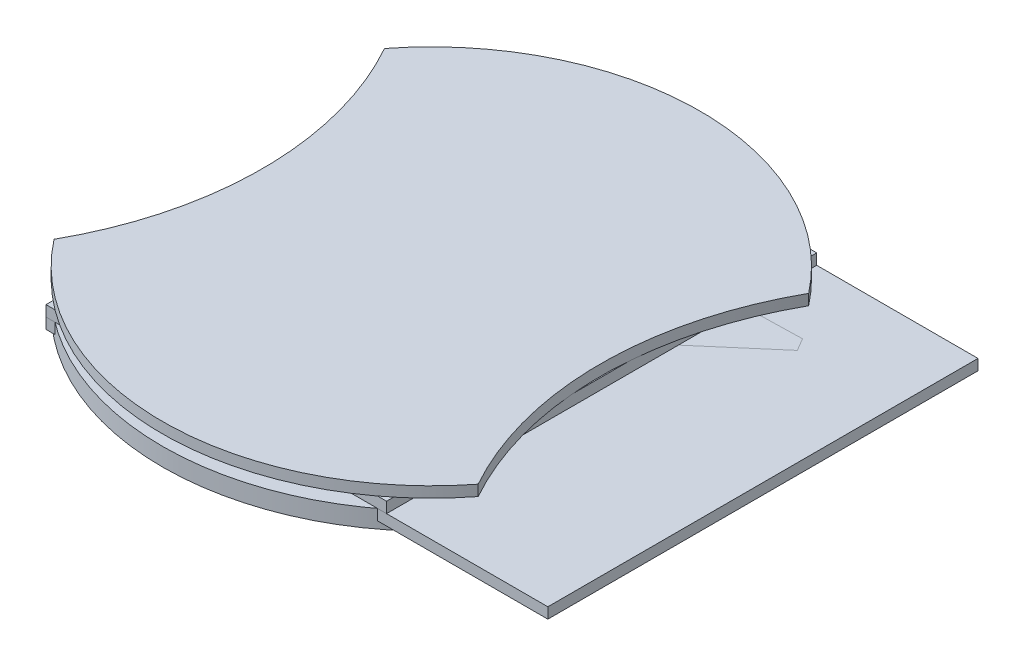
ISO-10303-21;
HEADER;
FILE_DESCRIPTION(('STEP AP214'),'2;1');
FILE_NAME('part.step','',(''),(''),'','','');
FILE_SCHEMA(('AUTOMOTIVE_DESIGN { 1 0 10303 214 1 1 1 1 }'));
ENDSEC;
DATA;
#1=APPLICATION_CONTEXT('core data for automotive mechanical design processes');
#2=APPLICATION_PROTOCOL_DEFINITION('international standard','automotive_design',2000,#1);
#3=PRODUCT_CONTEXT('',#1,'mechanical');
#4=PRODUCT('Part','Part','',(#3));
#5=PRODUCT_RELATED_PRODUCT_CATEGORY('part','',(#4));
#6=PRODUCT_DEFINITION_FORMATION('','',#4);
#7=PRODUCT_DEFINITION_CONTEXT('part definition',#1,'design');
#8=PRODUCT_DEFINITION('design','',#6,#7);
#9=PRODUCT_DEFINITION_SHAPE('','',#8);
#10=(LENGTH_UNIT() NAMED_UNIT(*) SI_UNIT(.MILLI.,.METRE.));
#11=(NAMED_UNIT(*) PLANE_ANGLE_UNIT() SI_UNIT($,.RADIAN.));
#12=(NAMED_UNIT(*) SI_UNIT($,.STERADIAN.) SOLID_ANGLE_UNIT());
#13=UNCERTAINTY_MEASURE_WITH_UNIT(LENGTH_MEASURE(1.E-05),#10,'distance_accuracy_value','');
#14=(GEOMETRIC_REPRESENTATION_CONTEXT(3) GLOBAL_UNCERTAINTY_ASSIGNED_CONTEXT((#13)) GLOBAL_UNIT_ASSIGNED_CONTEXT((#10,
#11,#12)) REPRESENTATION_CONTEXT('',''));
#15=CARTESIAN_POINT('',(0.,0.,0.));
#16=DIRECTION('',(0.,0.,1.));
#17=DIRECTION('',(1.,0.,0.));
#18=AXIS2_PLACEMENT_3D('',#15,#16,#17);
#19=CARTESIAN_POINT('',(47.5,3.,-60.));
#20=DIRECTION('',(0.,-1.,0.));
#21=DIRECTION('',(0.,0.,-1.));
#22=AXIS2_PLACEMENT_3D('',#19,#20,#21);
#23=PLANE('',#22);
#24=CARTESIAN_POINT('',(47.5,3.,-60.));
#25=DIRECTION('',(0.,1.,0.));
#26=DIRECTION('',(0.,0.,1.));
#27=AXIS2_PLACEMENT_3D('',#24,#25,#26);
#28=CIRCLE('',#27,67.);
#29=CARTESIAN_POINT('',(81.0410196624969,3.,-118.));
#30=VERTEX_POINT('',#29);
#31=CARTESIAN_POINT('',(13.9589803375032,3.,-118.));
#32=VERTEX_POINT('',#31);
#33=EDGE_CURVE('E149',#30,#32,#28,.T.);
#34=ORIENTED_EDGE('',*,*,#33,.F.);
#35=DIRECTION('',(1.,0.,0.));
#36=VECTOR('',#35,1.);
#37=CARTESIAN_POINT('',(0.,3.,-118.));
#38=LINE('',#37,#36);
#39=CARTESIAN_POINT('',(62.8622914957373,3.,-118.));
#40=VERTEX_POINT('',#39);
#41=EDGE_CURVE('E70',#40,#30,#38,.T.);
#42=ORIENTED_EDGE('',*,*,#41,.F.);
#43=CARTESIAN_POINT('',(47.5,3.,-60.));
#44=DIRECTION('',(0.,1.,0.));
#45=DIRECTION('',(0.,0.,1.));
#46=AXIS2_PLACEMENT_3D('',#43,#44,#45);
#47=CIRCLE('',#46,60.);
#48=CARTESIAN_POINT('',(32.1377085042628,3.,-118.));
#49=VERTEX_POINT('',#48);
#50=EDGE_CURVE('E156',#40,#49,#47,.T.);
#51=ORIENTED_EDGE('',*,*,#50,.T.);
#52=DIRECTION('',(-1.,0.,0.));
#53=VECTOR('',#52,1.);
#54=CARTESIAN_POINT('',(0.,3.,-118.));
#55=LINE('',#54,#53);
#56=EDGE_CURVE('E138',#49,#32,#55,.T.);
#57=ORIENTED_EDGE('',*,*,#56,.T.);
#58=EDGE_LOOP('',(#34,#42,#51,#57));
#59=FACE_BOUND('',#58,.T.);
#60=DIRECTION('',(0.,0.,1.));
#61=VECTOR('',#60,1.);
#62=CARTESIAN_POINT('',(-2.49999999999997,3.,0.));
#63=LINE('',#62,#61);
#64=CARTESIAN_POINT('',(-2.49999999999997,3.,-115.901699437495));
#65=VERTEX_POINT('',#64);
#66=CARTESIAN_POINT('',(-2.49999999999997,3.,-4.09830056250528));
#67=VERTEX_POINT('',#66);
#68=EDGE_CURVE('E166',#65,#67,#63,.T.);
#69=ORIENTED_EDGE('',*,*,#68,.T.);
#70=CARTESIAN_POINT('',(47.5,3.,-60.));
#71=DIRECTION('',(0.,-1.,0.));
#72=DIRECTION('',(0.,0.,-1.));
#73=AXIS2_PLACEMENT_3D('',#70,#71,#72);
#74=CIRCLE('',#73,75.);
#75=EDGE_CURVE('E282',#65,#67,#74,.T.);
#76=ORIENTED_EDGE('',*,*,#75,.F.);
#77=EDGE_LOOP('',(#69,#76));
#78=FACE_BOUND('',#77,.T.);
#79=CARTESIAN_POINT('',(76.9611123026037,3.,-19.6014497550546));
#80=DIRECTION('',(0.,-1.,0.));
#81=DIRECTION('',(0.,0.,-1.));
#82=AXIS2_PLACEMENT_3D('',#79,#80,#81);
#83=CIRCLE('',#82,1.5);
#84=CARTESIAN_POINT('',(76.9611123026037,3.,-21.1014497550546));
#85=VERTEX_POINT('',#84);
#86=EDGE_CURVE('E208',#85,#85,#83,.T.);
#87=ORIENTED_EDGE('',*,*,#86,.T.);
#88=EDGE_LOOP('',(#87));
#89=FACE_BOUND('',#88,.T.);
#90=CARTESIAN_POINT('',(76.9611123026037,3.,-100.398550244945));
#91=DIRECTION('',(0.,-1.,0.));
#92=DIRECTION('',(0.,0.,-1.));
#93=AXIS2_PLACEMENT_3D('',#90,#91,#92);
#94=CIRCLE('',#93,1.5);
#95=CARTESIAN_POINT('',(76.9611123026037,3.,-101.898550244945));
#96=VERTEX_POINT('',#95);
#97=EDGE_CURVE('E232',#96,#96,#94,.F.);
#98=ORIENTED_EDGE('',*,*,#97,.F.);
#99=EDGE_LOOP('',(#98));
#100=FACE_BOUND('',#99,.T.);
#101=CARTESIAN_POINT('',(7.49999999999986,3.,-5.15));
#102=DIRECTION('',(0.,-1.,0.));
#103=DIRECTION('',(0.,0.,-1.));
#104=AXIS2_PLACEMENT_3D('',#101,#102,#103);
#105=CIRCLE('',#104,1.25);
#106=CARTESIAN_POINT('',(7.49999999999986,3.,-6.4));
#107=VERTEX_POINT('',#106);
#108=EDGE_CURVE('E258',#107,#107,#105,.F.);
#109=ORIENTED_EDGE('',*,*,#108,.F.);
#110=EDGE_LOOP('',(#109));
#111=FACE_BOUND('',#110,.T.);
#112=CARTESIAN_POINT('',(87.4999999999999,3.,-114.85));
#113=DIRECTION('',(0.,-1.,0.));
#114=DIRECTION('',(0.,0.,-1.));
#115=AXIS2_PLACEMENT_3D('',#112,#113,#114);
#116=CIRCLE('',#115,1.25000000000001);
#117=CARTESIAN_POINT('',(87.4999999999999,3.,-116.1));
#118=VERTEX_POINT('',#117);
#119=EDGE_CURVE('E250',#118,#118,#116,.F.);
#120=ORIENTED_EDGE('',*,*,#119,.F.);
#121=EDGE_LOOP('',(#120));
#122=FACE_BOUND('',#121,.T.);
#123=CARTESIAN_POINT('',(7.49999999999986,3.,-114.85));
#124=DIRECTION('',(0.,-1.,0.));
#125=DIRECTION('',(0.,0.,-1.));
#126=AXIS2_PLACEMENT_3D('',#123,#124,#125);
#127=CIRCLE('',#126,1.25);
#128=CARTESIAN_POINT('',(7.49999999999986,3.,-116.1));
#129=VERTEX_POINT('',#128);
#130=EDGE_CURVE('E246',#129,#129,#127,.F.);
#131=ORIENTED_EDGE('',*,*,#130,.F.);
#132=EDGE_LOOP('',(#131));
#133=FACE_BOUND('',#132,.T.);
#134=CARTESIAN_POINT('',(87.4999999999999,3.,-5.14999999999999));
#135=DIRECTION('',(0.,-1.,0.));
#136=DIRECTION('',(0.,0.,-1.));
#137=AXIS2_PLACEMENT_3D('',#134,#135,#136);
#138=CIRCLE('',#137,1.25000000000001);
#139=CARTESIAN_POINT('',(87.4999999999999,3.,-6.4));
#140=VERTEX_POINT('',#139);
#141=EDGE_CURVE('E254',#140,#140,#138,.F.);
#142=ORIENTED_EDGE('',*,*,#141,.F.);
#143=EDGE_LOOP('',(#142));
#144=FACE_BOUND('',#143,.T.);
#145=CARTESIAN_POINT('',(47.5,3.,-60.));
#146=DIRECTION('',(0.,1.,0.));
#147=DIRECTION('',(0.,0.,1.));
#148=AXIS2_PLACEMENT_3D('',#145,#146,#147);
#149=CIRCLE('',#148,8.4);
#150=CARTESIAN_POINT('',(47.5,3.,-51.6));
#151=VERTEX_POINT('',#150);
#152=EDGE_CURVE('E241',#151,#151,#149,.T.);
#153=ORIENTED_EDGE('',*,*,#152,.F.);
#154=EDGE_LOOP('',(#153));
#155=FACE_BOUND('',#154,.T.);
#156=CARTESIAN_POINT('',(107.5,3.,-60.));
#157=DIRECTION('',(0.,1.,0.));
#158=DIRECTION('',(0.,0.,1.));
#159=AXIS2_PLACEMENT_3D('',#156,#157,#158);
#160=CIRCLE('',#159,8.4);
#161=CARTESIAN_POINT('',(107.5,3.,-51.6));
#162=VERTEX_POINT('',#161);
#163=EDGE_CURVE('E236',#162,#162,#160,.T.);
#164=ORIENTED_EDGE('',*,*,#163,.F.);
#165=EDGE_LOOP('',(#164));
#166=FACE_BOUND('',#165,.T.);
#167=CARTESIAN_POINT('',(18.0388876973964,3.,-19.6014497550546));
#168=DIRECTION('',(0.,-1.,0.));
#169=DIRECTION('',(0.,0.,-1.));
#170=AXIS2_PLACEMENT_3D('',#167,#168,#169);
#171=CIRCLE('',#170,1.5);
#172=CARTESIAN_POINT('',(18.0388876973964,3.,-21.1014497550546));
#173=VERTEX_POINT('',#172);
#174=EDGE_CURVE('E217',#173,#173,#171,.F.);
#175=ORIENTED_EDGE('',*,*,#174,.F.);
#176=EDGE_LOOP('',(#175));
#177=FACE_BOUND('',#176,.T.);
#178=CARTESIAN_POINT('',(18.0388876973964,3.,-100.398550244945));
#179=DIRECTION('',(0.,-1.,0.));
#180=DIRECTION('',(0.,0.,-1.));
#181=AXIS2_PLACEMENT_3D('',#178,#179,#180);
#182=CIRCLE('',#181,1.5);
#183=CARTESIAN_POINT('',(18.0388876973964,3.,-101.898550244945));
#184=VERTEX_POINT('',#183);
#185=EDGE_CURVE('E228',#184,#184,#182,.T.);
#186=ORIENTED_EDGE('',*,*,#185,.T.);
#187=EDGE_LOOP('',(#186));
#188=FACE_BOUND('',#187,.T.);
#189=CARTESIAN_POINT('',(47.5,3.,-60.));
#190=DIRECTION('',(0.,1.,0.));
#191=DIRECTION('',(0.,0.,1.));
#192=AXIS2_PLACEMENT_3D('',#189,#190,#191);
#193=CIRCLE('',#192,60.);
#194=CARTESIAN_POINT('',(32.1377085042628,3.,-2.));
#195=VERTEX_POINT('',#194);
#196=CARTESIAN_POINT('',(62.8622914957373,3.,-2.));
#197=VERTEX_POINT('',#196);
#198=EDGE_CURVE('E78',#195,#197,#193,.T.);
#199=ORIENTED_EDGE('',*,*,#198,.T.);
#200=DIRECTION('',(1.,0.,0.));
#201=VECTOR('',#200,1.);
#202=CARTESIAN_POINT('',(0.,3.,-2.));
#203=LINE('',#202,#201);
#204=CARTESIAN_POINT('',(81.0410196624968,3.,-2.));
#205=VERTEX_POINT('',#204);
#206=EDGE_CURVE('E181',#197,#205,#203,.T.);
#207=ORIENTED_EDGE('',*,*,#206,.T.);
#208=CARTESIAN_POINT('',(47.5,3.,-60.));
#209=DIRECTION('',(0.,1.,0.));
#210=DIRECTION('',(0.,0.,1.));
#211=AXIS2_PLACEMENT_3D('',#208,#209,#210);
#212=CIRCLE('',#211,67.);
#213=CARTESIAN_POINT('',(13.9589803375032,3.,-2.));
#214=VERTEX_POINT('',#213);
#215=EDGE_CURVE('E177',#214,#205,#212,.T.);
#216=ORIENTED_EDGE('',*,*,#215,.F.);
#217=DIRECTION('',(-1.,0.,0.));
#218=VECTOR('',#217,1.);
#219=CARTESIAN_POINT('',(0.,3.,-2.));
#220=LINE('',#219,#218);
#221=EDGE_CURVE('E173',#195,#214,#220,.T.);
#222=ORIENTED_EDGE('',*,*,#221,.F.);
#223=EDGE_LOOP('',(#199,#207,#216,#222));
#224=FACE_BOUND('',#223,.T.);
#225=ADVANCED_FACE('F54',(#59,#78,#89,#100,#111,#122,#133,#144,#155,#166,#177,#188,#224),#23,.F.);
#226=CARTESIAN_POINT('',(47.5,-2.,-60.));
#227=DIRECTION('',(0.,-1.,0.));
#228=DIRECTION('',(0.,0.,-1.));
#229=AXIS2_PLACEMENT_3D('',#226,#227,#228);
#230=PLANE('',#229);
#231=DIRECTION('',(-1.,0.,0.));
#232=VECTOR('',#231,1.);
#233=CARTESIAN_POINT('',(47.5,-2.,-118.));
#234=LINE('',#233,#232);
#235=CARTESIAN_POINT('',(81.0410196624969,-2.,-118.));
#236=VERTEX_POINT('',#235);
#237=CARTESIAN_POINT('',(62.8622914957373,-2.,-118.));
#238=VERTEX_POINT('',#237);
#239=EDGE_CURVE('E12',#236,#238,#234,.T.);
#240=ORIENTED_EDGE('',*,*,#239,.F.);
#241=CARTESIAN_POINT('',(47.5,-2.,-60.));
#242=DIRECTION('',(0.,-1.,0.));
#243=DIRECTION('',(0.,0.,-1.));
#244=AXIS2_PLACEMENT_3D('',#241,#242,#243);
#245=CIRCLE('',#244,67.);
#246=CARTESIAN_POINT('',(13.9589803375032,-2.,-118.));
#247=VERTEX_POINT('',#246);
#248=EDGE_CURVE('E313',#247,#236,#245,.T.);
#249=ORIENTED_EDGE('',*,*,#248,.F.);
#250=DIRECTION('',(1.,0.,0.));
#251=VECTOR('',#250,1.);
#252=CARTESIAN_POINT('',(47.5,-2.,-118.));
#253=LINE('',#252,#251);
#254=CARTESIAN_POINT('',(32.1377085042628,-2.,-118.));
#255=VERTEX_POINT('',#254);
#256=EDGE_CURVE('E141',#247,#255,#253,.T.);
#257=ORIENTED_EDGE('',*,*,#256,.T.);
#258=CARTESIAN_POINT('',(47.5,-2.,-60.));
#259=DIRECTION('',(0.,-1.,0.));
#260=DIRECTION('',(0.,0.,-1.));
#261=AXIS2_PLACEMENT_3D('',#258,#259,#260);
#262=CIRCLE('',#261,60.);
#263=EDGE_CURVE('E63',#255,#238,#262,.T.);
#264=ORIENTED_EDGE('',*,*,#263,.T.);
#265=EDGE_LOOP('',(#240,#249,#257,#264));
#266=FACE_BOUND('',#265,.T.);
#267=CARTESIAN_POINT('',(76.9611123026037,-2.,-19.6014497550546));
#268=DIRECTION('',(0.,-1.,0.));
#269=DIRECTION('',(0.,0.,-1.));
#270=AXIS2_PLACEMENT_3D('',#267,#268,#269);
#271=CIRCLE('',#270,1.5);
#272=CARTESIAN_POINT('',(76.9611123026037,-2.,-21.1014497550546));
#273=VERTEX_POINT('',#272);
#274=EDGE_CURVE('E204',#273,#273,#271,.T.);
#275=ORIENTED_EDGE('',*,*,#274,.F.);
#276=EDGE_LOOP('',(#275));
#277=FACE_BOUND('',#276,.T.);
#278=CARTESIAN_POINT('',(76.9611123026037,-2.,-100.398550244945));
#279=DIRECTION('',(0.,-1.,0.));
#280=DIRECTION('',(0.,0.,-1.));
#281=AXIS2_PLACEMENT_3D('',#278,#279,#280);
#282=CIRCLE('',#281,1.5);
#283=CARTESIAN_POINT('',(76.9611123026037,-2.,-101.898550244945));
#284=VERTEX_POINT('',#283);
#285=EDGE_CURVE('E213',#284,#284,#282,.F.);
#286=ORIENTED_EDGE('',*,*,#285,.T.);
#287=EDGE_LOOP('',(#286));
#288=FACE_BOUND('',#287,.T.);
#289=CARTESIAN_POINT('',(18.0388876973964,-2.,-19.6014497550546));
#290=DIRECTION('',(0.,-1.,0.));
#291=DIRECTION('',(0.,0.,-1.));
#292=AXIS2_PLACEMENT_3D('',#289,#290,#291);
#293=CIRCLE('',#292,1.5);
#294=CARTESIAN_POINT('',(18.0388876973964,-2.,-21.1014497550546));
#295=VERTEX_POINT('',#294);
#296=EDGE_CURVE('E212',#295,#295,#293,.F.);
#297=ORIENTED_EDGE('',*,*,#296,.T.);
#298=EDGE_LOOP('',(#297));
#299=FACE_BOUND('',#298,.T.);
#300=CARTESIAN_POINT('',(107.5,-2.,-60.));
#301=DIRECTION('',(0.,-1.,0.));
#302=DIRECTION('',(0.,0.,-1.));
#303=AXIS2_PLACEMENT_3D('',#300,#301,#302);
#304=CIRCLE('',#303,8.4);
#305=CARTESIAN_POINT('',(107.5,-2.,-68.4));
#306=VERTEX_POINT('',#305);
#307=EDGE_CURVE('E240',#306,#306,#304,.T.);
#308=ORIENTED_EDGE('',*,*,#307,.F.);
#309=EDGE_LOOP('',(#308));
#310=FACE_BOUND('',#309,.T.);
#311=CARTESIAN_POINT('',(47.5,-2.,-60.));
#312=DIRECTION('',(0.,-1.,0.));
#313=DIRECTION('',(0.,0.,-1.));
#314=AXIS2_PLACEMENT_3D('',#311,#312,#313);
#315=CIRCLE('',#314,8.4);
#316=CARTESIAN_POINT('',(47.5,-2.,-68.4));
#317=VERTEX_POINT('',#316);
#318=EDGE_CURVE('E245',#317,#317,#315,.T.);
#319=ORIENTED_EDGE('',*,*,#318,.F.);
#320=EDGE_LOOP('',(#319));
#321=FACE_BOUND('',#320,.T.);
#322=CARTESIAN_POINT('',(7.49999999999986,-2.,-114.85));
#323=DIRECTION('',(0.,-1.,0.));
#324=DIRECTION('',(0.,0.,-1.));
#325=AXIS2_PLACEMENT_3D('',#322,#323,#324);
#326=CIRCLE('',#325,1.25);
#327=CARTESIAN_POINT('',(7.49999999999986,-2.,-116.1));
#328=VERTEX_POINT('',#327);
#329=EDGE_CURVE('E266',#328,#328,#326,.T.);
#330=ORIENTED_EDGE('',*,*,#329,.F.);
#331=EDGE_LOOP('',(#330));
#332=FACE_BOUND('',#331,.T.);
#333=CARTESIAN_POINT('',(87.4999999999999,-2.,-5.14999999999999));
#334=DIRECTION('',(0.,-1.,0.));
#335=DIRECTION('',(0.,0.,-1.));
#336=AXIS2_PLACEMENT_3D('',#333,#334,#335);
#337=CIRCLE('',#336,1.25000000000001);
#338=CARTESIAN_POINT('',(87.4999999999999,-2.,-6.4));
#339=VERTEX_POINT('',#338);
#340=EDGE_CURVE('E274',#339,#339,#337,.T.);
#341=ORIENTED_EDGE('',*,*,#340,.F.);
#342=EDGE_LOOP('',(#341));
#343=FACE_BOUND('',#342,.T.);
#344=CARTESIAN_POINT('',(7.49999999999986,-2.,-5.15));
#345=DIRECTION('',(0.,-1.,0.));
#346=DIRECTION('',(0.,0.,-1.));
#347=AXIS2_PLACEMENT_3D('',#344,#345,#346);
#348=CIRCLE('',#347,1.25);
#349=CARTESIAN_POINT('',(7.49999999999986,-2.,-6.4));
#350=VERTEX_POINT('',#349);
#351=EDGE_CURVE('E270',#350,#350,#348,.T.);
#352=ORIENTED_EDGE('',*,*,#351,.F.);
#353=EDGE_LOOP('',(#352));
#354=FACE_BOUND('',#353,.T.);
#355=CARTESIAN_POINT('',(87.4999999999999,-2.,-114.85));
#356=DIRECTION('',(0.,-1.,0.));
#357=DIRECTION('',(0.,0.,-1.));
#358=AXIS2_PLACEMENT_3D('',#355,#356,#357);
#359=CIRCLE('',#358,1.25000000000001);
#360=CARTESIAN_POINT('',(87.4999999999999,-2.,-116.1));
#361=VERTEX_POINT('',#360);
#362=EDGE_CURVE('E262',#361,#361,#359,.T.);
#363=ORIENTED_EDGE('',*,*,#362,.F.);
#364=EDGE_LOOP('',(#363));
#365=FACE_BOUND('',#364,.T.);
#366=CARTESIAN_POINT('',(18.0388876973964,-2.,-100.398550244945));
#367=DIRECTION('',(0.,-1.,0.));
#368=DIRECTION('',(0.,0.,-1.));
#369=AXIS2_PLACEMENT_3D('',#366,#367,#368);
#370=CIRCLE('',#369,1.5);
#371=CARTESIAN_POINT('',(18.0388876973964,-2.,-101.898550244945));
#372=VERTEX_POINT('',#371);
#373=EDGE_CURVE('E218',#372,#372,#370,.T.);
#374=ORIENTED_EDGE('',*,*,#373,.F.);
#375=EDGE_LOOP('',(#374));
#376=FACE_BOUND('',#375,.T.);
#377=CARTESIAN_POINT('',(47.5,-2.,-60.));
#378=DIRECTION('',(0.,-1.,0.));
#379=DIRECTION('',(0.,0.,-1.));
#380=AXIS2_PLACEMENT_3D('',#377,#378,#379);
#381=CIRCLE('',#380,75.);
#382=CARTESIAN_POINT('',(-2.49999999999997,-2.,-115.901699437495));
#383=VERTEX_POINT('',#382);
#384=CARTESIAN_POINT('',(-2.49999999999997,-2.,-4.09830056250528));
#385=VERTEX_POINT('',#384);
#386=EDGE_CURVE('E278',#383,#385,#381,.T.);
#387=ORIENTED_EDGE('',*,*,#386,.T.);
#388=DIRECTION('',(0.,0.,-1.));
#389=VECTOR('',#388,1.);
#390=CARTESIAN_POINT('',(-2.49999999999997,-2.,-60.));
#391=LINE('',#390,#389);
#392=EDGE_CURVE('E200',#385,#383,#391,.T.);
#393=ORIENTED_EDGE('',*,*,#392,.T.);
#394=EDGE_LOOP('',(#387,#393));
#395=FACE_BOUND('',#394,.T.);
#396=DIRECTION('',(-1.,0.,0.));
#397=VECTOR('',#396,1.);
#398=CARTESIAN_POINT('',(47.5,-2.,-2.));
#399=LINE('',#398,#397);
#400=CARTESIAN_POINT('',(81.0410196624968,-2.,-2.));
#401=VERTEX_POINT('',#400);
#402=CARTESIAN_POINT('',(62.8622914957373,-2.,-2.));
#403=VERTEX_POINT('',#402);
#404=EDGE_CURVE('E305',#401,#403,#399,.T.);
#405=ORIENTED_EDGE('',*,*,#404,.T.);
#406=CARTESIAN_POINT('',(47.5,-2.,-60.));
#407=DIRECTION('',(0.,-1.,0.));
#408=DIRECTION('',(0.,0.,-1.));
#409=AXIS2_PLACEMENT_3D('',#406,#407,#408);
#410=CIRCLE('',#409,60.);
#411=CARTESIAN_POINT('',(32.1377085042628,-2.,-2.));
#412=VERTEX_POINT('',#411);
#413=EDGE_CURVE('E309',#403,#412,#410,.T.);
#414=ORIENTED_EDGE('',*,*,#413,.T.);
#415=DIRECTION('',(1.,0.,0.));
#416=VECTOR('',#415,1.);
#417=CARTESIAN_POINT('',(47.5,-2.,-2.));
#418=LINE('',#417,#416);
#419=CARTESIAN_POINT('',(13.9589803375032,-2.,-2.));
#420=VERTEX_POINT('',#419);
#421=EDGE_CURVE('E298',#420,#412,#418,.T.);
#422=ORIENTED_EDGE('',*,*,#421,.F.);
#423=CARTESIAN_POINT('',(47.5,-2.,-60.));
#424=DIRECTION('',(0.,-1.,0.));
#425=DIRECTION('',(0.,0.,-1.));
#426=AXIS2_PLACEMENT_3D('',#423,#424,#425);
#427=CIRCLE('',#426,67.);
#428=EDGE_CURVE('E301',#401,#420,#427,.T.);
#429=ORIENTED_EDGE('',*,*,#428,.F.);
#430=EDGE_LOOP('',(#405,#414,#422,#429));
#431=FACE_BOUND('',#430,.T.);
#432=ADVANCED_FACE('F321',(#266,#277,#288,#299,#310,#321,#332,#343,#354,#365,#376,#395,#431),
#230,.T.);
#433=CARTESIAN_POINT('',(47.5,-2.,-60.));
#434=DIRECTION('',(0.,1.,0.));
#435=DIRECTION('',(0.,0.,1.));
#436=AXIS2_PLACEMENT_3D('',#433,#434,#435);
#437=CYLINDRICAL_SURFACE('',#436,75.);
#438=DIRECTION('',(0.,1.,0.));
#439=VECTOR('',#438,1.);
#440=CARTESIAN_POINT('',(-2.49999999999997,-2.,-4.09830056250528));
#441=LINE('',#440,#439);
#442=EDGE_CURVE('E295',#385,#67,#441,.T.);
#443=ORIENTED_EDGE('',*,*,#442,.F.);
#444=ORIENTED_EDGE('',*,*,#386,.F.);
#445=DIRECTION('',(0.,1.,0.));
#446=VECTOR('',#445,1.);
#447=CARTESIAN_POINT('',(-2.49999999999997,-2.,-115.901699437495));
#448=LINE('',#447,#446);
#449=EDGE_CURVE('E286',#65,#383,#448,.F.);
#450=ORIENTED_EDGE('',*,*,#449,.F.);
#451=ORIENTED_EDGE('',*,*,#75,.T.);
#452=EDGE_LOOP('',(#443,#444,#450,#451));
#453=FACE_BOUND('',#452,.T.);
#454=ADVANCED_FACE('F345',(#453),#437,.T.);
#455=CARTESIAN_POINT('',(7.49999999999986,13.,-5.15));
#456=DIRECTION('',(0.,-1.,0.));
#457=DIRECTION('',(0.,0.,-1.));
#458=AXIS2_PLACEMENT_3D('',#455,#456,#457);
#459=CYLINDRICAL_SURFACE('',#458,1.25);
#460=ORIENTED_EDGE('',*,*,#108,.T.);
#461=EDGE_LOOP('',(#460));
#462=FACE_BOUND('',#461,.T.);
#463=ORIENTED_EDGE('',*,*,#351,.T.);
#464=EDGE_LOOP('',(#463));
#465=FACE_BOUND('',#464,.T.);
#466=ADVANCED_FACE('F56',(#462,#465),#459,.F.);
#467=CARTESIAN_POINT('',(87.4999999999999,13.,-5.14999999999999));
#468=DIRECTION('',(0.,-1.,0.));
#469=DIRECTION('',(0.,0.,-1.));
#470=AXIS2_PLACEMENT_3D('',#467,#468,#469);
#471=CYLINDRICAL_SURFACE('',#470,1.25000000000001);
#472=ORIENTED_EDGE('',*,*,#141,.T.);
#473=EDGE_LOOP('',(#472));
#474=FACE_BOUND('',#473,.T.);
#475=ORIENTED_EDGE('',*,*,#340,.T.);
#476=EDGE_LOOP('',(#475));
#477=FACE_BOUND('',#476,.T.);
#478=ADVANCED_FACE('F352',(#474,#477),#471,.F.);
#479=CARTESIAN_POINT('',(87.4999999999999,13.,-114.85));
#480=DIRECTION('',(0.,-1.,0.));
#481=DIRECTION('',(0.,0.,-1.));
#482=AXIS2_PLACEMENT_3D('',#479,#480,#481);
#483=CYLINDRICAL_SURFACE('',#482,1.25000000000001);
#484=ORIENTED_EDGE('',*,*,#119,.T.);
#485=EDGE_LOOP('',(#484));
#486=FACE_BOUND('',#485,.T.);
#487=ORIENTED_EDGE('',*,*,#362,.T.);
#488=EDGE_LOOP('',(#487));
#489=FACE_BOUND('',#488,.T.);
#490=ADVANCED_FACE('F355',(#486,#489),#483,.F.);
#491=CARTESIAN_POINT('',(7.49999999999986,13.,-114.85));
#492=DIRECTION('',(0.,-1.,0.));
#493=DIRECTION('',(0.,0.,-1.));
#494=AXIS2_PLACEMENT_3D('',#491,#492,#493);
#495=CYLINDRICAL_SURFACE('',#494,1.25);
#496=ORIENTED_EDGE('',*,*,#130,.T.);
#497=EDGE_LOOP('',(#496));
#498=FACE_BOUND('',#497,.T.);
#499=ORIENTED_EDGE('',*,*,#329,.T.);
#500=EDGE_LOOP('',(#499));
#501=FACE_BOUND('',#500,.T.);
#502=ADVANCED_FACE('F358',(#498,#501),#495,.F.);
#503=CARTESIAN_POINT('',(47.5,-7.,-60.));
#504=DIRECTION('',(0.,1.,0.));
#505=DIRECTION('',(0.,0.,1.));
#506=AXIS2_PLACEMENT_3D('',#503,#504,#505);
#507=CYLINDRICAL_SURFACE('',#506,8.4);
#508=ORIENTED_EDGE('',*,*,#318,.T.);
#509=EDGE_LOOP('',(#508));
#510=FACE_BOUND('',#509,.T.);
#511=ORIENTED_EDGE('',*,*,#152,.T.);
#512=EDGE_LOOP('',(#511));
#513=FACE_BOUND('',#512,.T.);
#514=ADVANCED_FACE('F361',(#510,#513),#507,.F.);
#515=CARTESIAN_POINT('',(107.5,-7.,-60.));
#516=DIRECTION('',(0.,1.,0.));
#517=DIRECTION('',(0.,0.,1.));
#518=AXIS2_PLACEMENT_3D('',#515,#516,#517);
#519=CYLINDRICAL_SURFACE('',#518,8.4);
#520=ORIENTED_EDGE('',*,*,#307,.T.);
#521=EDGE_LOOP('',(#520));
#522=FACE_BOUND('',#521,.T.);
#523=ORIENTED_EDGE('',*,*,#163,.T.);
#524=EDGE_LOOP('',(#523));
#525=FACE_BOUND('',#524,.T.);
#526=ADVANCED_FACE('F366',(#522,#525),#519,.F.);
#527=CARTESIAN_POINT('',(18.0388876973964,10.,-19.6014497550546));
#528=DIRECTION('',(0.,-1.,0.));
#529=DIRECTION('',(0.,0.,-1.));
#530=AXIS2_PLACEMENT_3D('',#527,#528,#529);
#531=CYLINDRICAL_SURFACE('',#530,1.5);
#532=ORIENTED_EDGE('',*,*,#296,.F.);
#533=EDGE_LOOP('',(#532));
#534=FACE_BOUND('',#533,.T.);
#535=ORIENTED_EDGE('',*,*,#174,.T.);
#536=EDGE_LOOP('',(#535));
#537=FACE_BOUND('',#536,.T.);
#538=ADVANCED_FACE('F417',(#534,#537),#531,.F.);
#539=CARTESIAN_POINT('',(18.0388876973964,10.,-100.398550244945));
#540=DIRECTION('',(0.,-1.,0.));
#541=DIRECTION('',(0.,0.,-1.));
#542=AXIS2_PLACEMENT_3D('',#539,#540,#541);
#543=CYLINDRICAL_SURFACE('',#542,1.5);
#544=ORIENTED_EDGE('',*,*,#373,.T.);
#545=EDGE_LOOP('',(#544));
#546=FACE_BOUND('',#545,.T.);
#547=ORIENTED_EDGE('',*,*,#185,.F.);
#548=EDGE_LOOP('',(#547));
#549=FACE_BOUND('',#548,.T.);
#550=ADVANCED_FACE('F413',(#546,#549),#543,.F.);
#551=CARTESIAN_POINT('',(76.9611123026037,10.,-100.398550244945));
#552=DIRECTION('',(0.,-1.,0.));
#553=DIRECTION('',(0.,0.,-1.));
#554=AXIS2_PLACEMENT_3D('',#551,#552,#553);
#555=CYLINDRICAL_SURFACE('',#554,1.5);
#556=ORIENTED_EDGE('',*,*,#285,.F.);
#557=EDGE_LOOP('',(#556));
#558=FACE_BOUND('',#557,.T.);
#559=ORIENTED_EDGE('',*,*,#97,.T.);
#560=EDGE_LOOP('',(#559));
#561=FACE_BOUND('',#560,.T.);
#562=ADVANCED_FACE('F409',(#558,#561),#555,.F.);
#563=CARTESIAN_POINT('',(76.9611123026037,8.,-19.6014497550546));
#564=DIRECTION('',(0.,-1.,0.));
#565=DIRECTION('',(0.,0.,-1.));
#566=AXIS2_PLACEMENT_3D('',#563,#564,#565);
#567=CYLINDRICAL_SURFACE('',#566,1.5);
#568=ORIENTED_EDGE('',*,*,#274,.T.);
#569=EDGE_LOOP('',(#568));
#570=FACE_BOUND('',#569,.T.);
#571=ORIENTED_EDGE('',*,*,#86,.F.);
#572=EDGE_LOOP('',(#571));
#573=FACE_BOUND('',#572,.T.);
#574=ADVANCED_FACE('F402',(#570,#573),#567,.F.);
#575=CARTESIAN_POINT('',(-2.49999999999997,-7.,0.));
#576=DIRECTION('',(-1.,0.,0.));
#577=DIRECTION('',(0.,0.,1.));
#578=AXIS2_PLACEMENT_3D('',#575,#576,#577);
#579=PLANE('',#578);
#580=ORIENTED_EDGE('',*,*,#442,.T.);
#581=ORIENTED_EDGE('',*,*,#68,.F.);
#582=ORIENTED_EDGE('',*,*,#449,.T.);
#583=ORIENTED_EDGE('',*,*,#392,.F.);
#584=EDGE_LOOP('',(#580,#581,#582,#583));
#585=FACE_BOUND('',#584,.T.);
#586=ADVANCED_FACE('F396',(#585),#579,.T.);
#587=CARTESIAN_POINT('',(47.5,-7.,-60.));
#588=DIRECTION('',(0.,1.,0.));
#589=DIRECTION('',(0.,0.,1.));
#590=AXIS2_PLACEMENT_3D('',#587,#588,#589);
#591=CYLINDRICAL_SURFACE('',#590,60.);
#592=DIRECTION('',(0.,1.,0.));
#593=VECTOR('',#592,1.);
#594=CARTESIAN_POINT('',(62.8622914957373,-7.,-2.));
#595=LINE('',#594,#593);
#596=EDGE_CURVE('E186',#403,#197,#595,.T.);
#597=ORIENTED_EDGE('',*,*,#596,.T.);
#598=ORIENTED_EDGE('',*,*,#198,.F.);
#599=DIRECTION('',(0.,1.,0.));
#600=VECTOR('',#599,1.);
#601=CARTESIAN_POINT('',(32.1377085042628,-7.,-2.));
#602=LINE('',#601,#600);
#603=EDGE_CURVE('E185',#412,#195,#602,.T.);
#604=ORIENTED_EDGE('',*,*,#603,.F.);
#605=ORIENTED_EDGE('',*,*,#413,.F.);
#606=EDGE_LOOP('',(#597,#598,#604,#605));
#607=FACE_BOUND('',#606,.T.);
#608=ADVANCED_FACE('F394',(#607),#591,.T.);
#609=CARTESIAN_POINT('',(0.,-7.,-2.));
#610=DIRECTION('',(0.,0.,1.));
#611=DIRECTION('',(1.,0.,0.));
#612=AXIS2_PLACEMENT_3D('',#609,#610,#611);
#613=PLANE('',#612);
#614=DIRECTION('',(0.,1.,0.));
#615=VECTOR('',#614,1.);
#616=CARTESIAN_POINT('',(81.0410196624968,-7.,-2.));
#617=LINE('',#616,#615);
#618=EDGE_CURVE('E189',#401,#205,#617,.T.);
#619=ORIENTED_EDGE('',*,*,#618,.T.);
#620=ORIENTED_EDGE('',*,*,#206,.F.);
#621=ORIENTED_EDGE('',*,*,#596,.F.);
#622=ORIENTED_EDGE('',*,*,#404,.F.);
#623=EDGE_LOOP('',(#619,#620,#621,#622));
#624=FACE_BOUND('',#623,.T.);
#625=ADVANCED_FACE('F388',(#624),#613,.T.);
#626=CARTESIAN_POINT('',(47.5,-7.,-60.));
#627=DIRECTION('',(0.,1.,0.));
#628=DIRECTION('',(0.,0.,1.));
#629=AXIS2_PLACEMENT_3D('',#626,#627,#628);
#630=CYLINDRICAL_SURFACE('',#629,67.);
#631=ORIENTED_EDGE('',*,*,#428,.T.);
#632=DIRECTION('',(0.,1.,0.));
#633=VECTOR('',#632,1.);
#634=CARTESIAN_POINT('',(13.9589803375032,-7.,-2.));
#635=LINE('',#634,#633);
#636=EDGE_CURVE('E192',#420,#214,#635,.T.);
#637=ORIENTED_EDGE('',*,*,#636,.T.);
#638=ORIENTED_EDGE('',*,*,#215,.T.);
#639=ORIENTED_EDGE('',*,*,#618,.F.);
#640=EDGE_LOOP('',(#631,#637,#638,#639));
#641=FACE_BOUND('',#640,.T.);
#642=ADVANCED_FACE('F335',(#641),#630,.F.);
#643=CARTESIAN_POINT('',(0.,-7.,-2.));
#644=DIRECTION('',(0.,0.,-1.));
#645=DIRECTION('',(-1.,0.,0.));
#646=AXIS2_PLACEMENT_3D('',#643,#644,#645);
#647=PLANE('',#646);
#648=ORIENTED_EDGE('',*,*,#421,.T.);
#649=ORIENTED_EDGE('',*,*,#603,.T.);
#650=ORIENTED_EDGE('',*,*,#221,.T.);
#651=ORIENTED_EDGE('',*,*,#636,.F.);
#652=EDGE_LOOP('',(#648,#649,#650,#651));
#653=FACE_BOUND('',#652,.T.);
#654=ADVANCED_FACE('F328',(#653),#647,.F.);
#655=CARTESIAN_POINT('',(0.,-7.,-118.));
#656=DIRECTION('',(0.,0.,1.));
#657=DIRECTION('',(1.,0.,0.));
#658=AXIS2_PLACEMENT_3D('',#655,#656,#657);
#659=PLANE('',#658);
#660=ORIENTED_EDGE('',*,*,#239,.T.);
#661=DIRECTION('',(0.,1.,0.));
#662=VECTOR('',#661,1.);
#663=CARTESIAN_POINT('',(62.8622914957373,-7.,-118.));
#664=LINE('',#663,#662);
#665=EDGE_CURVE('E163',#238,#40,#664,.T.);
#666=ORIENTED_EDGE('',*,*,#665,.T.);
#667=ORIENTED_EDGE('',*,*,#41,.T.);
#668=DIRECTION('',(0.,1.,0.));
#669=VECTOR('',#668,1.);
#670=CARTESIAN_POINT('',(81.0410196624969,-7.,-118.));
#671=LINE('',#670,#669);
#672=EDGE_CURVE('E146',#236,#30,#671,.T.);
#673=ORIENTED_EDGE('',*,*,#672,.F.);
#674=EDGE_LOOP('',(#660,#666,#667,#673));
#675=FACE_BOUND('',#674,.T.);
#676=ADVANCED_FACE('F326',(#675),#659,.F.);
#677=CARTESIAN_POINT('',(47.5,-7.,-60.));
#678=DIRECTION('',(0.,1.,0.));
#679=DIRECTION('',(0.,0.,1.));
#680=AXIS2_PLACEMENT_3D('',#677,#678,#679);
#681=CYLINDRICAL_SURFACE('',#680,60.);
#682=DIRECTION('',(0.,1.,0.));
#683=VECTOR('',#682,1.);
#684=CARTESIAN_POINT('',(32.1377085042628,-7.,-118.));
#685=LINE('',#684,#683);
#686=EDGE_CURVE('E145',#255,#49,#685,.T.);
#687=ORIENTED_EDGE('',*,*,#686,.T.);
#688=ORIENTED_EDGE('',*,*,#50,.F.);
#689=ORIENTED_EDGE('',*,*,#665,.F.);
#690=ORIENTED_EDGE('',*,*,#263,.F.);
#691=EDGE_LOOP('',(#687,#688,#689,#690));
#692=FACE_BOUND('',#691,.T.);
#693=ADVANCED_FACE('F325',(#692),#681,.T.);
#694=CARTESIAN_POINT('',(0.,-7.,-118.));
#695=DIRECTION('',(0.,0.,-1.));
#696=DIRECTION('',(-1.,0.,0.));
#697=AXIS2_PLACEMENT_3D('',#694,#695,#696);
#698=PLANE('',#697);
#699=DIRECTION('',(0.,1.,0.));
#700=VECTOR('',#699,1.);
#701=CARTESIAN_POINT('',(13.9589803375032,-7.,-118.));
#702=LINE('',#701,#700);
#703=EDGE_CURVE('E133',#247,#32,#702,.T.);
#704=ORIENTED_EDGE('',*,*,#703,.T.);
#705=ORIENTED_EDGE('',*,*,#56,.F.);
#706=ORIENTED_EDGE('',*,*,#686,.F.);
#707=ORIENTED_EDGE('',*,*,#256,.F.);
#708=EDGE_LOOP('',(#704,#705,#706,#707));
#709=FACE_BOUND('',#708,.T.);
#710=ADVANCED_FACE('F135',(#709),#698,.T.);
#711=CARTESIAN_POINT('',(47.5,-7.,-60.));
#712=DIRECTION('',(0.,1.,0.));
#713=DIRECTION('',(0.,0.,1.));
#714=AXIS2_PLACEMENT_3D('',#711,#712,#713);
#715=CYLINDRICAL_SURFACE('',#714,67.);
#716=ORIENTED_EDGE('',*,*,#248,.T.);
#717=ORIENTED_EDGE('',*,*,#672,.T.);
#718=ORIENTED_EDGE('',*,*,#33,.T.);
#719=ORIENTED_EDGE('',*,*,#703,.F.);
#720=EDGE_LOOP('',(#716,#717,#718,#719));
#721=FACE_BOUND('',#720,.T.);
#722=ADVANCED_FACE('F150',(#721),#715,.F.);
#723=CLOSED_SHELL('',(#225,#432,#454,#466,#478,#490,#502,#514,#526,#538,#550,#562,#574,#586,
#608,#625,#642,#654,#676,#693,#710,#722));
#724=MANIFOLD_SOLID_BREP('B2',#723);
#725=CARTESIAN_POINT('',(47.5,9.,-60.));
#726=DIRECTION('',(0.,-1.,0.));
#727=DIRECTION('',(0.,0.,-1.));
#728=AXIS2_PLACEMENT_3D('',#725,#726,#727);
#729=CYLINDRICAL_SURFACE('',#728,75.);
#730=CARTESIAN_POINT('',(47.5,6.,-60.));
#731=DIRECTION('',(0.,1.,0.));
#732=DIRECTION('',(0.,0.,1.));
#733=AXIS2_PLACEMENT_3D('',#730,#731,#732);
#734=CIRCLE('',#733,75.);
#735=CARTESIAN_POINT('',(106.66,6.,-106.098746186854));
#736=VERTEX_POINT('',#735);
#737=CARTESIAN_POINT('',(-11.66,6.,-106.098746186854));
#738=VERTEX_POINT('',#737);
#739=EDGE_CURVE('E685',#736,#738,#734,.T.);
#740=ORIENTED_EDGE('',*,*,#739,.T.);
#741=DIRECTION('',(0.,1.,0.));
#742=VECTOR('',#741,1.);
#743=CARTESIAN_POINT('',(-11.66,0.,-106.098746186854));
#744=LINE('',#743,#742);
#745=CARTESIAN_POINT('',(-11.66,9.,-106.098746186854));
#746=VERTEX_POINT('',#745);
#747=EDGE_CURVE('E644',#738,#746,#744,.T.);
#748=ORIENTED_EDGE('',*,*,#747,.T.);
#749=CARTESIAN_POINT('',(47.5,9.,-60.));
#750=DIRECTION('',(0.,1.,0.));
#751=DIRECTION('',(0.,0.,1.));
#752=AXIS2_PLACEMENT_3D('',#749,#750,#751);
#753=CIRCLE('',#752,75.);
#754=CARTESIAN_POINT('',(106.66,9.,-106.098746186854));
#755=VERTEX_POINT('',#754);
#756=EDGE_CURVE('E683',#755,#746,#753,.T.);
#757=ORIENTED_EDGE('',*,*,#756,.F.);
#758=DIRECTION('',(0.,1.,0.));
#759=VECTOR('',#758,1.);
#760=CARTESIAN_POINT('',(106.66,0.,-106.098746186854));
#761=LINE('',#760,#759);
#762=EDGE_CURVE('E691',#736,#755,#761,.T.);
#763=ORIENTED_EDGE('',*,*,#762,.F.);
#764=EDGE_LOOP('',(#740,#748,#757,#763));
#765=FACE_BOUND('',#764,.T.);
#766=ADVANCED_FACE('F629',(#765),#729,.T.);
#767=CARTESIAN_POINT('',(-11.66,9.,-13.9012538131458));
#768=VERTEX_POINT('',#767);
#769=CARTESIAN_POINT('',(106.66,9.,-13.9012538131458));
#770=VERTEX_POINT('',#769);
#771=EDGE_CURVE('E681',#768,#770,#753,.T.);
#772=ORIENTED_EDGE('',*,*,#771,.F.);
#773=DIRECTION('',(0.,1.,0.));
#774=VECTOR('',#773,1.);
#775=CARTESIAN_POINT('',(-11.66,0.,-13.9012538131458));
#776=LINE('',#775,#774);
#777=CARTESIAN_POINT('',(-11.66,6.,-13.9012538131458));
#778=VERTEX_POINT('',#777);
#779=EDGE_CURVE('E667',#778,#768,#776,.T.);
#780=ORIENTED_EDGE('',*,*,#779,.F.);
#781=CARTESIAN_POINT('',(106.66,6.,-13.9012538131458));
#782=VERTEX_POINT('',#781);
#783=EDGE_CURVE('E688',#778,#782,#734,.T.);
#784=ORIENTED_EDGE('',*,*,#783,.T.);
#785=DIRECTION('',(0.,1.,0.));
#786=VECTOR('',#785,1.);
#787=CARTESIAN_POINT('',(106.66,0.,-13.9012538131458));
#788=LINE('',#787,#786);
#789=EDGE_CURVE('E651',#782,#770,#788,.T.);
#790=ORIENTED_EDGE('',*,*,#789,.T.);
#791=EDGE_LOOP('',(#772,#780,#784,#790));
#792=FACE_BOUND('',#791,.T.);
#793=ADVANCED_FACE('F631',(#792),#729,.T.);
#794=CARTESIAN_POINT('',(47.5,9.,-60.));
#795=DIRECTION('',(0.,1.,0.));
#796=DIRECTION('',(0.,0.,1.));
#797=AXIS2_PLACEMENT_3D('',#794,#795,#796);
#798=PLANE('',#797);
#799=CARTESIAN_POINT('',(-94.126810840622,9.,-60.));
#800=DIRECTION('',(0.,1.,0.));
#801=DIRECTION('',(0.,0.,-1.));
#802=AXIS2_PLACEMENT_3D('',#799,#800,#801);
#803=CIRCLE('',#802,94.4768187981736);
#804=EDGE_CURVE('E670',#768,#746,#803,.T.);
#805=ORIENTED_EDGE('',*,*,#804,.F.);
#806=ORIENTED_EDGE('',*,*,#771,.T.);
#807=CARTESIAN_POINT('',(189.126810840622,9.,-60.));
#808=DIRECTION('',(0.,1.,0.));
#809=DIRECTION('',(0.,0.,1.));
#810=AXIS2_PLACEMENT_3D('',#807,#808,#809);
#811=CIRCLE('',#810,94.4768187981736);
#812=EDGE_CURVE('E699',#755,#770,#811,.T.);
#813=ORIENTED_EDGE('',*,*,#812,.F.);
#814=ORIENTED_EDGE('',*,*,#756,.T.);
#815=EDGE_LOOP('',(#805,#806,#813,#814));
#816=FACE_BOUND('',#815,.T.);
#817=ADVANCED_FACE('F679',(#816),#798,.T.);
#818=CARTESIAN_POINT('',(47.5,6.,-60.));
#819=DIRECTION('',(0.,1.,0.));
#820=DIRECTION('',(0.,0.,1.));
#821=AXIS2_PLACEMENT_3D('',#818,#819,#820);
#822=PLANE('',#821);
#823=ORIENTED_EDGE('',*,*,#783,.F.);
#824=CARTESIAN_POINT('',(-94.126810840622,6.,-60.));
#825=DIRECTION('',(0.,1.,0.));
#826=DIRECTION('',(0.,0.,1.));
#827=AXIS2_PLACEMENT_3D('',#824,#825,#826);
#828=CIRCLE('',#827,94.4768187981736);
#829=EDGE_CURVE('E52',#778,#738,#828,.T.);
#830=ORIENTED_EDGE('',*,*,#829,.T.);
#831=ORIENTED_EDGE('',*,*,#739,.F.);
#832=CARTESIAN_POINT('',(189.126810840622,6.,-60.));
#833=DIRECTION('',(0.,1.,0.));
#834=DIRECTION('',(0.,0.,1.));
#835=AXIS2_PLACEMENT_3D('',#832,#833,#834);
#836=CIRCLE('',#835,94.4768187981736);
#837=EDGE_CURVE('E637',#736,#782,#836,.T.);
#838=ORIENTED_EDGE('',*,*,#837,.T.);
#839=EDGE_LOOP('',(#823,#830,#831,#838));
#840=FACE_BOUND('',#839,.T.);
#841=ADVANCED_FACE('F695',(#840),#822,.F.);
#842=CARTESIAN_POINT('',(189.126810840622,0.,-60.));
#843=DIRECTION('',(0.,1.,0.));
#844=DIRECTION('',(0.,0.,1.));
#845=AXIS2_PLACEMENT_3D('',#842,#843,#844);
#846=CYLINDRICAL_SURFACE('',#845,94.4768187981736);
#847=ORIENTED_EDGE('',*,*,#762,.T.);
#848=ORIENTED_EDGE('',*,*,#812,.T.);
#849=ORIENTED_EDGE('',*,*,#789,.F.);
#850=ORIENTED_EDGE('',*,*,#837,.F.);
#851=EDGE_LOOP('',(#847,#848,#849,#850));
#852=FACE_BOUND('',#851,.T.);
#853=ADVANCED_FACE('F697',(#852),#846,.F.);
#854=CARTESIAN_POINT('',(-94.126810840622,0.,-60.));
#855=DIRECTION('',(0.,1.,0.));
#856=DIRECTION('',(0.,0.,1.));
#857=AXIS2_PLACEMENT_3D('',#854,#855,#856);
#858=CYLINDRICAL_SURFACE('',#857,94.4768187981736);
#859=ORIENTED_EDGE('',*,*,#779,.T.);
#860=ORIENTED_EDGE('',*,*,#804,.T.);
#861=ORIENTED_EDGE('',*,*,#747,.F.);
#862=ORIENTED_EDGE('',*,*,#829,.F.);
#863=EDGE_LOOP('',(#859,#860,#861,#862));
#864=FACE_BOUND('',#863,.T.);
#865=ADVANCED_FACE('F669',(#864),#858,.F.);
#866=CLOSED_SHELL('',(#766,#793,#817,#841,#853,#865));
#867=MANIFOLD_SOLID_BREP('B6_NOT_SHOWN',#866);
#868=CARTESIAN_POINT('',(0.,6.,-120.));
#869=DIRECTION('',(1.,0.,0.));
#870=DIRECTION('',(0.,0.,-1.));
#871=AXIS2_PLACEMENT_3D('',#868,#869,#870);
#872=PLANE('',#871);
#873=DIRECTION('',(0.,0.,1.));
#874=VECTOR('',#873,1.);
#875=CARTESIAN_POINT('',(0.,3.,-120.));
#876=LINE('',#875,#874);
#877=CARTESIAN_POINT('',(0.,3.,-120.));
#878=VERTEX_POINT('',#877);
#879=CARTESIAN_POINT('',(0.,3.,0.));
#880=VERTEX_POINT('',#879);
#881=EDGE_CURVE('E822',#878,#880,#876,.T.);
#882=ORIENTED_EDGE('',*,*,#881,.T.);
#883=DIRECTION('',(0.,-1.,0.));
#884=VECTOR('',#883,1.);
#885=CARTESIAN_POINT('',(0.,6.,0.));
#886=LINE('',#885,#884);
#887=CARTESIAN_POINT('',(0.,6.,0.));
#888=VERTEX_POINT('',#887);
#889=EDGE_CURVE('E627',#888,#880,#886,.T.);
#890=ORIENTED_EDGE('',*,*,#889,.F.);
#891=DIRECTION('',(0.,0.,1.));
#892=VECTOR('',#891,1.);
#893=CARTESIAN_POINT('',(0.,6.,-120.));
#894=LINE('',#893,#892);
#895=CARTESIAN_POINT('',(0.,6.,-120.));
#896=VERTEX_POINT('',#895);
#897=EDGE_CURVE('E810',#896,#888,#894,.T.);
#898=ORIENTED_EDGE('',*,*,#897,.F.);
#899=DIRECTION('',(0.,-1.,0.));
#900=VECTOR('',#899,1.);
#901=CARTESIAN_POINT('',(0.,6.,-120.));
#902=LINE('',#901,#900);
#903=EDGE_CURVE('E818',#896,#878,#902,.T.);
#904=ORIENTED_EDGE('',*,*,#903,.T.);
#905=EDGE_LOOP('',(#882,#890,#898,#904));
#906=FACE_BOUND('',#905,.T.);
#907=ADVANCED_FACE('F759',(#906),#872,.F.);
#908=CARTESIAN_POINT('',(0.,6.,0.));
#909=DIRECTION('',(0.,0.,-1.));
#910=DIRECTION('',(-1.,0.,0.));
#911=AXIS2_PLACEMENT_3D('',#908,#909,#910);
#912=PLANE('',#911);
#913=DIRECTION('',(1.,0.,0.));
#914=VECTOR('',#913,1.);
#915=CARTESIAN_POINT('',(0.,3.,0.));
#916=LINE('',#915,#914);
#917=CARTESIAN_POINT('',(95.,3.,0.));
#918=VERTEX_POINT('',#917);
#919=EDGE_CURVE('E814',#880,#918,#916,.T.);
#920=ORIENTED_EDGE('',*,*,#919,.T.);
#921=DIRECTION('',(0.,-1.,0.));
#922=VECTOR('',#921,1.);
#923=CARTESIAN_POINT('',(95.,6.,0.));
#924=LINE('',#923,#922);
#925=CARTESIAN_POINT('',(95.,6.,0.));
#926=VERTEX_POINT('',#925);
#927=EDGE_CURVE('E767',#926,#918,#924,.T.);
#928=ORIENTED_EDGE('',*,*,#927,.F.);
#929=DIRECTION('',(1.,0.,0.));
#930=VECTOR('',#929,1.);
#931=CARTESIAN_POINT('',(0.,6.,0.));
#932=LINE('',#931,#930);
#933=EDGE_CURVE('E805',#888,#926,#932,.T.);
#934=ORIENTED_EDGE('',*,*,#933,.F.);
#935=ORIENTED_EDGE('',*,*,#889,.T.);
#936=EDGE_LOOP('',(#920,#928,#934,#935));
#937=FACE_BOUND('',#936,.T.);
#938=ADVANCED_FACE('F813',(#937),#912,.F.);
#939=CARTESIAN_POINT('',(95.,6.,-120.));
#940=DIRECTION('',(-1.,0.,0.));
#941=DIRECTION('',(0.,0.,1.));
#942=AXIS2_PLACEMENT_3D('',#939,#940,#941);
#943=PLANE('',#942);
#944=DIRECTION('',(0.,0.,-1.));
#945=VECTOR('',#944,1.);
#946=CARTESIAN_POINT('',(95.,3.,-120.));
#947=LINE('',#946,#945);
#948=CARTESIAN_POINT('',(95.,3.,-120.));
#949=VERTEX_POINT('',#948);
#950=EDGE_CURVE('E792',#918,#949,#947,.T.);
#951=ORIENTED_EDGE('',*,*,#950,.T.);
#952=DIRECTION('',(0.,-1.,0.));
#953=VECTOR('',#952,1.);
#954=CARTESIAN_POINT('',(95.,6.,-120.));
#955=LINE('',#954,#953);
#956=CARTESIAN_POINT('',(95.,6.,-120.));
#957=VERTEX_POINT('',#956);
#958=EDGE_CURVE('E815',#957,#949,#955,.T.);
#959=ORIENTED_EDGE('',*,*,#958,.F.);
#960=DIRECTION('',(0.,0.,-1.));
#961=VECTOR('',#960,1.);
#962=CARTESIAN_POINT('',(95.,6.,-120.));
#963=LINE('',#962,#961);
#964=EDGE_CURVE('E808',#926,#957,#963,.T.);
#965=ORIENTED_EDGE('',*,*,#964,.F.);
#966=ORIENTED_EDGE('',*,*,#927,.T.);
#967=EDGE_LOOP('',(#951,#959,#965,#966));
#968=FACE_BOUND('',#967,.T.);
#969=ADVANCED_FACE('F816',(#968),#943,.F.);
#970=CARTESIAN_POINT('',(0.,6.,-120.));
#971=DIRECTION('',(0.,0.,1.));
#972=DIRECTION('',(1.,0.,0.));
#973=AXIS2_PLACEMENT_3D('',#970,#971,#972);
#974=PLANE('',#973);
#975=DIRECTION('',(-1.,0.,0.));
#976=VECTOR('',#975,1.);
#977=CARTESIAN_POINT('',(0.,3.,-120.));
#978=LINE('',#977,#976);
#979=EDGE_CURVE('E798',#949,#878,#978,.T.);
#980=ORIENTED_EDGE('',*,*,#979,.T.);
#981=ORIENTED_EDGE('',*,*,#903,.F.);
#982=DIRECTION('',(-1.,0.,0.));
#983=VECTOR('',#982,1.);
#984=CARTESIAN_POINT('',(0.,6.,-120.));
#985=LINE('',#984,#983);
#986=EDGE_CURVE('E775',#957,#896,#985,.T.);
#987=ORIENTED_EDGE('',*,*,#986,.F.);
#988=ORIENTED_EDGE('',*,*,#958,.T.);
#989=EDGE_LOOP('',(#980,#981,#987,#988));
#990=FACE_BOUND('',#989,.T.);
#991=ADVANCED_FACE('F829',(#990),#974,.F.);
#992=CARTESIAN_POINT('',(0.,6.,0.));
#993=DIRECTION('',(0.,1.,0.));
#994=DIRECTION('',(0.,0.,1.));
#995=AXIS2_PLACEMENT_3D('',#992,#993,#994);
#996=PLANE('',#995);
#997=ORIENTED_EDGE('',*,*,#897,.T.);
#998=ORIENTED_EDGE('',*,*,#933,.T.);
#999=ORIENTED_EDGE('',*,*,#964,.T.);
#1000=ORIENTED_EDGE('',*,*,#986,.T.);
#1001=EDGE_LOOP('',(#997,#998,#999,#1000));
#1002=FACE_BOUND('',#1001,.T.);
#1003=ADVANCED_FACE('F806',(#1002),#996,.T.);
#1004=CARTESIAN_POINT('',(0.,3.,0.));
#1005=DIRECTION('',(0.,1.,0.));
#1006=DIRECTION('',(0.,0.,1.));
#1007=AXIS2_PLACEMENT_3D('',#1004,#1005,#1006);
#1008=PLANE('',#1007);
#1009=ORIENTED_EDGE('',*,*,#881,.F.);
#1010=ORIENTED_EDGE('',*,*,#979,.F.);
#1011=ORIENTED_EDGE('',*,*,#950,.F.);
#1012=ORIENTED_EDGE('',*,*,#919,.F.);
#1013=EDGE_LOOP('',(#1009,#1010,#1011,#1012));
#1014=FACE_BOUND('',#1013,.T.);
#1015=ADVANCED_FACE('F832',(#1014),#1008,.F.);
#1016=CLOSED_SHELL('',(#907,#938,#969,#991,#1003,#1015));
#1017=MANIFOLD_SOLID_BREP('B46_NOT_SHOWN',#1016);
#1018=CARTESIAN_POINT('',(0.,3.,0.));
#1019=DIRECTION('',(1.,0.,0.));
#1020=DIRECTION('',(0.,0.,-1.));
#1021=AXIS2_PLACEMENT_3D('',#1018,#1019,#1020);
#1022=PLANE('',#1021);
#1023=DIRECTION('',(0.,0.,1.));
#1024=VECTOR('',#1023,1.);
#1025=CARTESIAN_POINT('',(0.,0.,0.));
#1026=LINE('',#1025,#1024);
#1027=CARTESIAN_POINT('',(0.,0.,-120.));
#1028=VERTEX_POINT('',#1027);
#1029=CARTESIAN_POINT('',(0.,0.,0.));
#1030=VERTEX_POINT('',#1029);
#1031=EDGE_CURVE('E946',#1028,#1030,#1026,.T.);
#1032=ORIENTED_EDGE('',*,*,#1031,.T.);
#1033=DIRECTION('',(0.,-1.,0.));
#1034=VECTOR('',#1033,1.);
#1035=CARTESIAN_POINT('',(0.,3.,0.));
#1036=LINE('',#1035,#1034);
#1037=CARTESIAN_POINT('',(0.,3.,0.));
#1038=VERTEX_POINT('',#1037);
#1039=EDGE_CURVE('E757',#1038,#1030,#1036,.T.);
#1040=ORIENTED_EDGE('',*,*,#1039,.F.);
#1041=DIRECTION('',(0.,0.,1.));
#1042=VECTOR('',#1041,1.);
#1043=CARTESIAN_POINT('',(0.,3.,0.));
#1044=LINE('',#1043,#1042);
#1045=CARTESIAN_POINT('',(0.,3.,-120.));
#1046=VERTEX_POINT('',#1045);
#1047=EDGE_CURVE('E934',#1046,#1038,#1044,.T.);
#1048=ORIENTED_EDGE('',*,*,#1047,.F.);
#1049=DIRECTION('',(0.,-1.,0.));
#1050=VECTOR('',#1049,1.);
#1051=CARTESIAN_POINT('',(0.,3.,-120.));
#1052=LINE('',#1051,#1050);
#1053=EDGE_CURVE('E942',#1046,#1028,#1052,.T.);
#1054=ORIENTED_EDGE('',*,*,#1053,.T.);
#1055=EDGE_LOOP('',(#1032,#1040,#1048,#1054));
#1056=FACE_BOUND('',#1055,.T.);
#1057=ADVANCED_FACE('F883',(#1056),#1022,.F.);
#1058=CARTESIAN_POINT('',(0.,3.,0.));
#1059=DIRECTION('',(0.,0.,-1.));
#1060=DIRECTION('',(-1.,0.,0.));
#1061=AXIS2_PLACEMENT_3D('',#1058,#1059,#1060);
#1062=PLANE('',#1061);
#1063=DIRECTION('',(1.,0.,0.));
#1064=VECTOR('',#1063,1.);
#1065=CARTESIAN_POINT('',(0.,0.,0.));
#1066=LINE('',#1065,#1064);
#1067=CARTESIAN_POINT('',(140.,0.,0.));
#1068=VERTEX_POINT('',#1067);
#1069=EDGE_CURVE('E938',#1030,#1068,#1066,.T.);
#1070=ORIENTED_EDGE('',*,*,#1069,.T.);
#1071=DIRECTION('',(0.,-1.,0.));
#1072=VECTOR('',#1071,1.);
#1073=CARTESIAN_POINT('',(140.,3.,0.));
#1074=LINE('',#1073,#1072);
#1075=CARTESIAN_POINT('',(140.,3.,0.));
#1076=VERTEX_POINT('',#1075);
#1077=EDGE_CURVE('E891',#1076,#1068,#1074,.T.);
#1078=ORIENTED_EDGE('',*,*,#1077,.F.);
#1079=DIRECTION('',(1.,0.,0.));
#1080=VECTOR('',#1079,1.);
#1081=CARTESIAN_POINT('',(0.,3.,0.));
#1082=LINE('',#1081,#1080);
#1083=EDGE_CURVE('E929',#1038,#1076,#1082,.T.);
#1084=ORIENTED_EDGE('',*,*,#1083,.F.);
#1085=ORIENTED_EDGE('',*,*,#1039,.T.);
#1086=EDGE_LOOP('',(#1070,#1078,#1084,#1085));
#1087=FACE_BOUND('',#1086,.T.);
#1088=ADVANCED_FACE('F937',(#1087),#1062,.F.);
#1089=CARTESIAN_POINT('',(140.,3.,0.));
#1090=DIRECTION('',(-1.,0.,0.));
#1091=DIRECTION('',(0.,0.,1.));
#1092=AXIS2_PLACEMENT_3D('',#1089,#1090,#1091);
#1093=PLANE('',#1092);
#1094=DIRECTION('',(0.,0.,-1.));
#1095=VECTOR('',#1094,1.);
#1096=CARTESIAN_POINT('',(140.,0.,0.));
#1097=LINE('',#1096,#1095);
#1098=CARTESIAN_POINT('',(140.,0.,-120.));
#1099=VERTEX_POINT('',#1098);
#1100=EDGE_CURVE('E916',#1068,#1099,#1097,.T.);
#1101=ORIENTED_EDGE('',*,*,#1100,.T.);
#1102=DIRECTION('',(0.,-1.,0.));
#1103=VECTOR('',#1102,1.);
#1104=CARTESIAN_POINT('',(140.,3.,-120.));
#1105=LINE('',#1104,#1103);
#1106=CARTESIAN_POINT('',(140.,3.,-120.));
#1107=VERTEX_POINT('',#1106);
#1108=EDGE_CURVE('E939',#1107,#1099,#1105,.T.);
#1109=ORIENTED_EDGE('',*,*,#1108,.F.);
#1110=DIRECTION('',(0.,0.,-1.));
#1111=VECTOR('',#1110,1.);
#1112=CARTESIAN_POINT('',(140.,3.,0.));
#1113=LINE('',#1112,#1111);
#1114=EDGE_CURVE('E932',#1076,#1107,#1113,.T.);
#1115=ORIENTED_EDGE('',*,*,#1114,.F.);
#1116=ORIENTED_EDGE('',*,*,#1077,.T.);
#1117=EDGE_LOOP('',(#1101,#1109,#1115,#1116));
#1118=FACE_BOUND('',#1117,.T.);
#1119=ADVANCED_FACE('F940',(#1118),#1093,.F.);
#1120=CARTESIAN_POINT('',(0.,3.,-120.));
#1121=DIRECTION('',(0.,0.,1.));
#1122=DIRECTION('',(1.,0.,0.));
#1123=AXIS2_PLACEMENT_3D('',#1120,#1121,#1122);
#1124=PLANE('',#1123);
#1125=DIRECTION('',(-1.,0.,0.));
#1126=VECTOR('',#1125,1.);
#1127=CARTESIAN_POINT('',(0.,0.,-120.));
#1128=LINE('',#1127,#1126);
#1129=EDGE_CURVE('E922',#1099,#1028,#1128,.T.);
#1130=ORIENTED_EDGE('',*,*,#1129,.T.);
#1131=ORIENTED_EDGE('',*,*,#1053,.F.);
#1132=DIRECTION('',(-1.,0.,0.));
#1133=VECTOR('',#1132,1.);
#1134=CARTESIAN_POINT('',(0.,3.,-120.));
#1135=LINE('',#1134,#1133);
#1136=EDGE_CURVE('E899',#1107,#1046,#1135,.T.);
#1137=ORIENTED_EDGE('',*,*,#1136,.F.);
#1138=ORIENTED_EDGE('',*,*,#1108,.T.);
#1139=EDGE_LOOP('',(#1130,#1131,#1137,#1138));
#1140=FACE_BOUND('',#1139,.T.);
#1141=ADVANCED_FACE('F953',(#1140),#1124,.F.);
#1142=CARTESIAN_POINT('',(0.,3.,0.));
#1143=DIRECTION('',(0.,-1.,0.));
#1144=DIRECTION('',(0.,0.,-1.));
#1145=AXIS2_PLACEMENT_3D('',#1142,#1143,#1144);
#1146=PLANE('',#1145);
#1147=ORIENTED_EDGE('',*,*,#1047,.T.);
#1148=ORIENTED_EDGE('',*,*,#1083,.T.);
#1149=ORIENTED_EDGE('',*,*,#1114,.T.);
#1150=ORIENTED_EDGE('',*,*,#1136,.T.);
#1151=EDGE_LOOP('',(#1147,#1148,#1149,#1150));
#1152=FACE_BOUND('',#1151,.T.);
#1153=ADVANCED_FACE('F930',(#1152),#1146,.F.);
#1154=CARTESIAN_POINT('',(0.,0.,0.));
#1155=DIRECTION('',(0.,-1.,0.));
#1156=DIRECTION('',(0.,0.,-1.));
#1157=AXIS2_PLACEMENT_3D('',#1154,#1155,#1156);
#1158=PLANE('',#1157);
#1159=ORIENTED_EDGE('',*,*,#1031,.F.);
#1160=ORIENTED_EDGE('',*,*,#1129,.F.);
#1161=ORIENTED_EDGE('',*,*,#1100,.F.);
#1162=ORIENTED_EDGE('',*,*,#1069,.F.);
#1163=EDGE_LOOP('',(#1159,#1160,#1161,#1162));
#1164=FACE_BOUND('',#1163,.T.);
#1165=ADVANCED_FACE('F956',(#1164),#1158,.T.);
#1166=CLOSED_SHELL('',(#1057,#1088,#1119,#1141,#1153,#1165));
#1167=MANIFOLD_SOLID_BREP('B621_NOT_SHOWN',#1166);
#1168=ADVANCED_BREP_SHAPE_REPRESENTATION('',(#18,#724,#867,#1017,#1167),#14);
#1169=SHAPE_DEFINITION_REPRESENTATION(#9,#1168);
ENDSEC;
END-ISO-10303-21;
